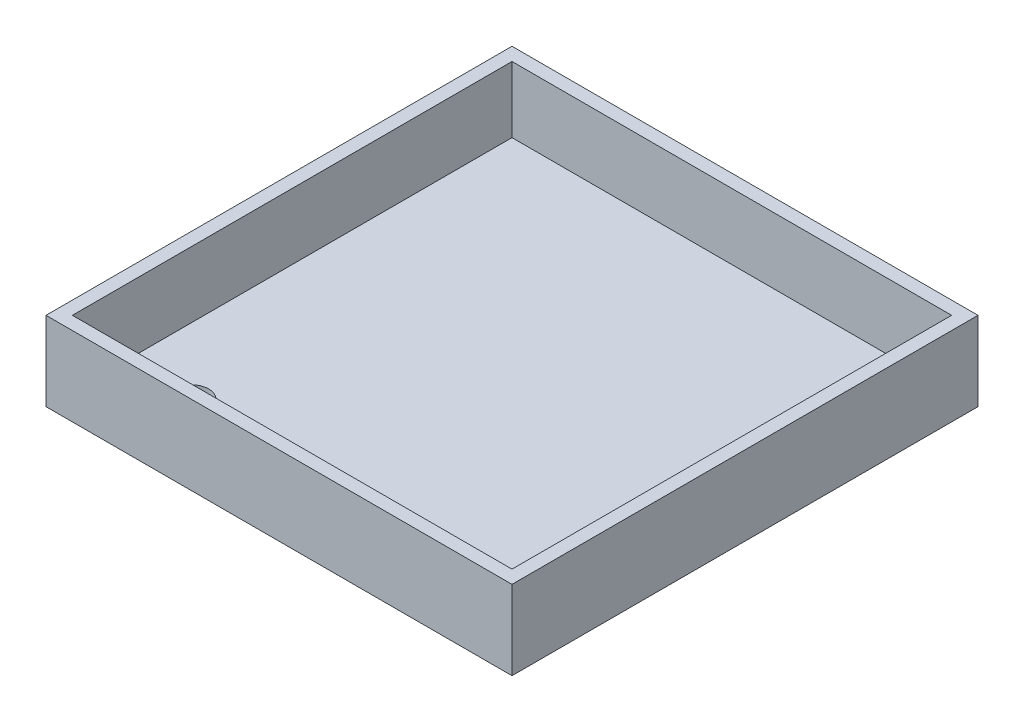
ISO-10303-21;
HEADER;
FILE_DESCRIPTION(('STEP AP214'),'2;1');
FILE_NAME('part.step','',(''),(''),'','','');
FILE_SCHEMA(('AUTOMOTIVE_DESIGN { 1 0 10303 214 1 1 1 1 }'));
ENDSEC;
DATA;
#1=APPLICATION_CONTEXT('core data for automotive mechanical design processes');
#2=APPLICATION_PROTOCOL_DEFINITION('international standard','automotive_design',2000,#1);
#3=PRODUCT_CONTEXT('',#1,'mechanical');
#4=PRODUCT('Part','Part','',(#3));
#5=PRODUCT_RELATED_PRODUCT_CATEGORY('part','',(#4));
#6=PRODUCT_DEFINITION_FORMATION('','',#4);
#7=PRODUCT_DEFINITION_CONTEXT('part definition',#1,'design');
#8=PRODUCT_DEFINITION('design','',#6,#7);
#9=PRODUCT_DEFINITION_SHAPE('','',#8);
#10=(LENGTH_UNIT() NAMED_UNIT(*) SI_UNIT(.MILLI.,.METRE.));
#11=(NAMED_UNIT(*) PLANE_ANGLE_UNIT() SI_UNIT($,.RADIAN.));
#12=(NAMED_UNIT(*) SI_UNIT($,.STERADIAN.) SOLID_ANGLE_UNIT());
#13=UNCERTAINTY_MEASURE_WITH_UNIT(LENGTH_MEASURE(1.E-05),#10,'distance_accuracy_value','');
#14=(GEOMETRIC_REPRESENTATION_CONTEXT(3) GLOBAL_UNCERTAINTY_ASSIGNED_CONTEXT((#13)) GLOBAL_UNIT_ASSIGNED_CONTEXT((#10,
#11,#12)) REPRESENTATION_CONTEXT('',''));
#15=CARTESIAN_POINT('',(0.,0.,0.));
#16=DIRECTION('',(0.,0.,1.));
#17=DIRECTION('',(1.,0.,0.));
#18=AXIS2_PLACEMENT_3D('',#15,#16,#17);
#19=CARTESIAN_POINT('',(0.,3.,0.));
#20=DIRECTION('',(0.,1.,0.));
#21=DIRECTION('',(0.,0.,1.));
#22=AXIS2_PLACEMENT_3D('',#19,#20,#21);
#23=PLANE('',#22);
#24=CARTESIAN_POINT('',(89.,3.,88.));
#25=DIRECTION('',(0.,1.,0.));
#26=DIRECTION('',(0.,0.,1.));
#27=AXIS2_PLACEMENT_3D('',#24,#25,#26);
#28=CIRCLE('',#27,2.);
#29=CARTESIAN_POINT('',(89.,3.,90.));
#30=VERTEX_POINT('',#29);
#31=EDGE_CURVE('E199',#30,#30,#28,.T.);
#32=ORIENTED_EDGE('',*,*,#31,.F.);
#33=EDGE_LOOP('',(#32));
#34=FACE_BOUND('',#33,.T.);
#35=CARTESIAN_POINT('',(15.,3.,88.));
#36=DIRECTION('',(0.,1.,0.));
#37=DIRECTION('',(0.,0.,1.));
#38=AXIS2_PLACEMENT_3D('',#35,#36,#37);
#39=CIRCLE('',#38,4.);
#40=CARTESIAN_POINT('',(15.,3.,92.));
#41=VERTEX_POINT('',#40);
#42=EDGE_CURVE('E202',#41,#41,#39,.T.);
#43=ORIENTED_EDGE('',*,*,#42,.F.);
#44=EDGE_LOOP('',(#43));
#45=FACE_BOUND('',#44,.T.);
#46=DIRECTION('',(0.,0.,1.));
#47=VECTOR('',#46,1.);
#48=CARTESIAN_POINT('',(0.,3.,0.));
#49=LINE('',#48,#47);
#50=CARTESIAN_POINT('',(0.,3.,0.));
#51=VERTEX_POINT('',#50);
#52=CARTESIAN_POINT('',(0.,3.,100.));
#53=VERTEX_POINT('',#52);
#54=EDGE_CURVE('E158',#51,#53,#49,.T.);
#55=ORIENTED_EDGE('',*,*,#54,.T.);
#56=DIRECTION('',(1.,0.,0.));
#57=VECTOR('',#56,1.);
#58=CARTESIAN_POINT('',(0.,3.,100.));
#59=LINE('',#58,#57);
#60=CARTESIAN_POINT('',(100.,3.,100.));
#61=VERTEX_POINT('',#60);
#62=EDGE_CURVE('E165',#53,#61,#59,.T.);
#63=ORIENTED_EDGE('',*,*,#62,.T.);
#64=DIRECTION('',(0.,0.,-1.));
#65=VECTOR('',#64,1.);
#66=CARTESIAN_POINT('',(100.,3.,0.));
#67=LINE('',#66,#65);
#68=CARTESIAN_POINT('',(100.,3.,0.));
#69=VERTEX_POINT('',#68);
#70=EDGE_CURVE('E44',#61,#69,#67,.T.);
#71=ORIENTED_EDGE('',*,*,#70,.T.);
#72=DIRECTION('',(-1.,0.,0.));
#73=VECTOR('',#72,1.);
#74=CARTESIAN_POINT('',(0.,3.,0.));
#75=LINE('',#74,#73);
#76=EDGE_CURVE('E11',#69,#51,#75,.T.);
#77=ORIENTED_EDGE('',*,*,#76,.T.);
#78=EDGE_LOOP('',(#55,#63,#71,#77));
#79=FACE_BOUND('',#78,.T.);
#80=ADVANCED_FACE('F36',(#34,#45,#79),#23,.T.);
#81=CARTESIAN_POINT('',(0.,0.,0.));
#82=DIRECTION('',(0.,1.,0.));
#83=DIRECTION('',(0.,0.,1.));
#84=AXIS2_PLACEMENT_3D('',#81,#82,#83);
#85=PLANE('',#84);
#86=CARTESIAN_POINT('',(89.,0.,88.));
#87=DIRECTION('',(0.,1.,0.));
#88=DIRECTION('',(0.,0.,1.));
#89=AXIS2_PLACEMENT_3D('',#86,#87,#88);
#90=CIRCLE('',#89,2.);
#91=CARTESIAN_POINT('',(89.,0.,90.));
#92=VERTEX_POINT('',#91);
#93=EDGE_CURVE('E204',#92,#92,#90,.T.);
#94=ORIENTED_EDGE('',*,*,#93,.T.);
#95=EDGE_LOOP('',(#94));
#96=FACE_BOUND('',#95,.T.);
#97=CARTESIAN_POINT('',(15.,0.,88.));
#98=DIRECTION('',(0.,1.,0.));
#99=DIRECTION('',(0.,0.,1.));
#100=AXIS2_PLACEMENT_3D('',#97,#98,#99);
#101=CIRCLE('',#100,4.);
#102=CARTESIAN_POINT('',(15.,0.,92.));
#103=VERTEX_POINT('',#102);
#104=EDGE_CURVE('E128',#103,#103,#101,.T.);
#105=ORIENTED_EDGE('',*,*,#104,.T.);
#106=EDGE_LOOP('',(#105));
#107=FACE_BOUND('',#106,.T.);
#108=DIRECTION('',(1.,0.,0.));
#109=VECTOR('',#108,1.);
#110=CARTESIAN_POINT('',(0.,0.,103.));
#111=LINE('',#110,#109);
#112=CARTESIAN_POINT('',(-2.99999999999999,0.,103.));
#113=VERTEX_POINT('',#112);
#114=CARTESIAN_POINT('',(103.,0.,103.));
#115=VERTEX_POINT('',#114);
#116=EDGE_CURVE('E100',#113,#115,#111,.T.);
#117=ORIENTED_EDGE('',*,*,#116,.F.);
#118=DIRECTION('',(0.,0.,1.));
#119=VECTOR('',#118,1.);
#120=CARTESIAN_POINT('',(-3.,0.,-3.));
#121=LINE('',#120,#119);
#122=CARTESIAN_POINT('',(-3.,0.,-3.));
#123=VERTEX_POINT('',#122);
#124=EDGE_CURVE('E139',#123,#113,#121,.T.);
#125=ORIENTED_EDGE('',*,*,#124,.F.);
#126=DIRECTION('',(-1.,0.,0.));
#127=VECTOR('',#126,1.);
#128=CARTESIAN_POINT('',(100.,0.,-3.));
#129=LINE('',#128,#127);
#130=CARTESIAN_POINT('',(103.,0.,-3.));
#131=VERTEX_POINT('',#130);
#132=EDGE_CURVE('E115',#131,#123,#129,.T.);
#133=ORIENTED_EDGE('',*,*,#132,.F.);
#134=DIRECTION('',(0.,0.,-1.));
#135=VECTOR('',#134,1.);
#136=CARTESIAN_POINT('',(103.,0.,103.));
#137=LINE('',#136,#135);
#138=EDGE_CURVE('E114',#115,#131,#137,.T.);
#139=ORIENTED_EDGE('',*,*,#138,.F.);
#140=EDGE_LOOP('',(#117,#125,#133,#139));
#141=FACE_BOUND('',#140,.T.);
#142=ADVANCED_FACE('F38',(#96,#107,#141),#85,.F.);
#143=CARTESIAN_POINT('',(0.,0.,100.));
#144=DIRECTION('',(0.,0.,-1.));
#145=DIRECTION('',(-1.,0.,0.));
#146=AXIS2_PLACEMENT_3D('',#143,#144,#145);
#147=PLANE('',#146);
#148=ORIENTED_EDGE('',*,*,#62,.F.);
#149=DIRECTION('',(0.,-1.,0.));
#150=VECTOR('',#149,1.);
#151=CARTESIAN_POINT('',(0.,0.,100.));
#152=LINE('',#151,#150);
#153=CARTESIAN_POINT('',(0.,18.,100.));
#154=VERTEX_POINT('',#153);
#155=EDGE_CURVE('E152',#154,#53,#152,.T.);
#156=ORIENTED_EDGE('',*,*,#155,.F.);
#157=DIRECTION('',(-1.,0.,0.));
#158=VECTOR('',#157,1.);
#159=CARTESIAN_POINT('',(0.,18.,100.));
#160=LINE('',#159,#158);
#161=CARTESIAN_POINT('',(100.,18.,100.));
#162=VERTEX_POINT('',#161);
#163=EDGE_CURVE('E111',#162,#154,#160,.T.);
#164=ORIENTED_EDGE('',*,*,#163,.F.);
#165=DIRECTION('',(0.,1.,0.));
#166=VECTOR('',#165,1.);
#167=CARTESIAN_POINT('',(100.,0.,100.));
#168=LINE('',#167,#166);
#169=EDGE_CURVE('E58',#61,#162,#168,.T.);
#170=ORIENTED_EDGE('',*,*,#169,.F.);
#171=EDGE_LOOP('',(#148,#156,#164,#170));
#172=FACE_BOUND('',#171,.T.);
#173=ADVANCED_FACE('F182',(#172),#147,.T.);
#174=CARTESIAN_POINT('',(0.,18.,103.));
#175=DIRECTION('',(0.,-1.,0.));
#176=DIRECTION('',(0.,0.,-1.));
#177=AXIS2_PLACEMENT_3D('',#174,#175,#176);
#178=PLANE('',#177);
#179=DIRECTION('',(1.,0.,0.));
#180=VECTOR('',#179,1.);
#181=CARTESIAN_POINT('',(100.,18.,0.));
#182=LINE('',#181,#180);
#183=CARTESIAN_POINT('',(0.,18.,0.));
#184=VERTEX_POINT('',#183);
#185=CARTESIAN_POINT('',(100.,18.,0.));
#186=VERTEX_POINT('',#185);
#187=EDGE_CURVE('E150',#184,#186,#182,.T.);
#188=ORIENTED_EDGE('',*,*,#187,.T.);
#189=DIRECTION('',(0.,0.,1.));
#190=VECTOR('',#189,1.);
#191=CARTESIAN_POINT('',(100.,18.,103.));
#192=LINE('',#191,#190);
#193=EDGE_CURVE('E125',#186,#162,#192,.T.);
#194=ORIENTED_EDGE('',*,*,#193,.T.);
#195=ORIENTED_EDGE('',*,*,#163,.T.);
#196=DIRECTION('',(0.,0.,-1.));
#197=VECTOR('',#196,1.);
#198=CARTESIAN_POINT('',(0.,18.,-3.));
#199=LINE('',#198,#197);
#200=EDGE_CURVE('E134',#154,#184,#199,.T.);
#201=ORIENTED_EDGE('',*,*,#200,.T.);
#202=EDGE_LOOP('',(#188,#194,#195,#201));
#203=FACE_BOUND('',#202,.T.);
#204=DIRECTION('',(0.,0.,1.));
#205=VECTOR('',#204,1.);
#206=CARTESIAN_POINT('',(103.,18.,103.));
#207=LINE('',#206,#205);
#208=CARTESIAN_POINT('',(103.,18.,-3.));
#209=VERTEX_POINT('',#208);
#210=CARTESIAN_POINT('',(103.,18.,103.));
#211=VERTEX_POINT('',#210);
#212=EDGE_CURVE('E124',#209,#211,#207,.T.);
#213=ORIENTED_EDGE('',*,*,#212,.F.);
#214=DIRECTION('',(1.,0.,0.));
#215=VECTOR('',#214,1.);
#216=CARTESIAN_POINT('',(100.,18.,-3.));
#217=LINE('',#216,#215);
#218=CARTESIAN_POINT('',(-3.,18.,-3.));
#219=VERTEX_POINT('',#218);
#220=EDGE_CURVE('E149',#219,#209,#217,.T.);
#221=ORIENTED_EDGE('',*,*,#220,.F.);
#222=DIRECTION('',(0.,0.,-1.));
#223=VECTOR('',#222,1.);
#224=CARTESIAN_POINT('',(-3.,18.,-3.));
#225=LINE('',#224,#223);
#226=CARTESIAN_POINT('',(-2.99999999999999,18.,103.));
#227=VERTEX_POINT('',#226);
#228=EDGE_CURVE('E142',#227,#219,#225,.T.);
#229=ORIENTED_EDGE('',*,*,#228,.F.);
#230=DIRECTION('',(-1.,0.,0.));
#231=VECTOR('',#230,1.);
#232=CARTESIAN_POINT('',(0.,18.,103.));
#233=LINE('',#232,#231);
#234=EDGE_CURVE('E110',#211,#227,#233,.T.);
#235=ORIENTED_EDGE('',*,*,#234,.F.);
#236=EDGE_LOOP('',(#213,#221,#229,#235));
#237=FACE_BOUND('',#236,.T.);
#238=ADVANCED_FACE('F179',(#203,#237),#178,.F.);
#239=CARTESIAN_POINT('',(0.,0.,103.));
#240=DIRECTION('',(0.,0.,-1.));
#241=DIRECTION('',(-1.,0.,0.));
#242=AXIS2_PLACEMENT_3D('',#239,#240,#241);
#243=PLANE('',#242);
#244=ORIENTED_EDGE('',*,*,#234,.T.);
#245=DIRECTION('',(0.,1.,0.));
#246=VECTOR('',#245,1.);
#247=CARTESIAN_POINT('',(-2.99999999999999,0.,103.));
#248=LINE('',#247,#246);
#249=EDGE_CURVE('E106',#113,#227,#248,.T.);
#250=ORIENTED_EDGE('',*,*,#249,.F.);
#251=ORIENTED_EDGE('',*,*,#116,.T.);
#252=DIRECTION('',(0.,-1.,0.));
#253=VECTOR('',#252,1.);
#254=CARTESIAN_POINT('',(103.,0.,103.));
#255=LINE('',#254,#253);
#256=EDGE_CURVE('E104',#211,#115,#255,.T.);
#257=ORIENTED_EDGE('',*,*,#256,.F.);
#258=EDGE_LOOP('',(#244,#250,#251,#257));
#259=FACE_BOUND('',#258,.T.);
#260=ADVANCED_FACE('F102',(#259),#243,.F.);
#261=CARTESIAN_POINT('',(0.,0.,0.));
#262=DIRECTION('',(0.,0.,1.));
#263=DIRECTION('',(1.,0.,0.));
#264=AXIS2_PLACEMENT_3D('',#261,#262,#263);
#265=PLANE('',#264);
#266=ORIENTED_EDGE('',*,*,#76,.F.);
#267=DIRECTION('',(0.,-1.,0.));
#268=VECTOR('',#267,1.);
#269=CARTESIAN_POINT('',(100.,0.,0.));
#270=LINE('',#269,#268);
#271=EDGE_CURVE('E145',#186,#69,#270,.T.);
#272=ORIENTED_EDGE('',*,*,#271,.F.);
#273=ORIENTED_EDGE('',*,*,#187,.F.);
#274=DIRECTION('',(0.,1.,0.));
#275=VECTOR('',#274,1.);
#276=CARTESIAN_POINT('',(0.,0.,0.));
#277=LINE('',#276,#275);
#278=EDGE_CURVE('E51',#51,#184,#277,.T.);
#279=ORIENTED_EDGE('',*,*,#278,.F.);
#280=EDGE_LOOP('',(#266,#272,#273,#279));
#281=FACE_BOUND('',#280,.T.);
#282=ADVANCED_FACE('F174',(#281),#265,.T.);
#283=CARTESIAN_POINT('',(0.,0.,-3.));
#284=DIRECTION('',(0.,0.,1.));
#285=DIRECTION('',(1.,0.,0.));
#286=AXIS2_PLACEMENT_3D('',#283,#284,#285);
#287=PLANE('',#286);
#288=ORIENTED_EDGE('',*,*,#220,.T.);
#289=DIRECTION('',(0.,1.,0.));
#290=VECTOR('',#289,1.);
#291=CARTESIAN_POINT('',(103.,0.,-3.));
#292=LINE('',#291,#290);
#293=EDGE_CURVE('E119',#131,#209,#292,.T.);
#294=ORIENTED_EDGE('',*,*,#293,.F.);
#295=ORIENTED_EDGE('',*,*,#132,.T.);
#296=DIRECTION('',(0.,-1.,0.));
#297=VECTOR('',#296,1.);
#298=CARTESIAN_POINT('',(-3.,0.,-3.));
#299=LINE('',#298,#297);
#300=EDGE_CURVE('E136',#219,#123,#299,.T.);
#301=ORIENTED_EDGE('',*,*,#300,.F.);
#302=EDGE_LOOP('',(#288,#294,#295,#301));
#303=FACE_BOUND('',#302,.T.);
#304=ADVANCED_FACE('F229',(#303),#287,.F.);
#305=CARTESIAN_POINT('',(-3.,0.,0.));
#306=DIRECTION('',(1.,0.,0.));
#307=DIRECTION('',(0.,0.,-1.));
#308=AXIS2_PLACEMENT_3D('',#305,#306,#307);
#309=PLANE('',#308);
#310=ORIENTED_EDGE('',*,*,#300,.T.);
#311=ORIENTED_EDGE('',*,*,#124,.T.);
#312=ORIENTED_EDGE('',*,*,#249,.T.);
#313=ORIENTED_EDGE('',*,*,#228,.T.);
#314=EDGE_LOOP('',(#310,#311,#312,#313));
#315=FACE_BOUND('',#314,.T.);
#316=ADVANCED_FACE('F226',(#315),#309,.F.);
#317=CARTESIAN_POINT('',(0.,0.,0.));
#318=DIRECTION('',(1.,0.,0.));
#319=DIRECTION('',(0.,0.,-1.));
#320=AXIS2_PLACEMENT_3D('',#317,#318,#319);
#321=PLANE('',#320);
#322=ORIENTED_EDGE('',*,*,#200,.F.);
#323=ORIENTED_EDGE('',*,*,#155,.T.);
#324=ORIENTED_EDGE('',*,*,#54,.F.);
#325=ORIENTED_EDGE('',*,*,#278,.T.);
#326=EDGE_LOOP('',(#322,#323,#324,#325));
#327=FACE_BOUND('',#326,.T.);
#328=ADVANCED_FACE('F178',(#327),#321,.T.);
#329=CARTESIAN_POINT('',(103.,0.,0.));
#330=DIRECTION('',(-1.,0.,0.));
#331=DIRECTION('',(0.,0.,1.));
#332=AXIS2_PLACEMENT_3D('',#329,#330,#331);
#333=PLANE('',#332);
#334=ORIENTED_EDGE('',*,*,#256,.T.);
#335=ORIENTED_EDGE('',*,*,#138,.T.);
#336=ORIENTED_EDGE('',*,*,#293,.T.);
#337=ORIENTED_EDGE('',*,*,#212,.T.);
#338=EDGE_LOOP('',(#334,#335,#336,#337));
#339=FACE_BOUND('',#338,.T.);
#340=ADVANCED_FACE('F122',(#339),#333,.F.);
#341=CARTESIAN_POINT('',(100.,0.,0.));
#342=DIRECTION('',(-1.,0.,0.));
#343=DIRECTION('',(0.,0.,1.));
#344=AXIS2_PLACEMENT_3D('',#341,#342,#343);
#345=PLANE('',#344);
#346=ORIENTED_EDGE('',*,*,#193,.F.);
#347=ORIENTED_EDGE('',*,*,#271,.T.);
#348=ORIENTED_EDGE('',*,*,#70,.F.);
#349=ORIENTED_EDGE('',*,*,#169,.T.);
#350=EDGE_LOOP('',(#346,#347,#348,#349));
#351=FACE_BOUND('',#350,.T.);
#352=ADVANCED_FACE('F173',(#351),#345,.T.);
#353=CARTESIAN_POINT('',(15.,3.,88.));
#354=DIRECTION('',(0.,1.,0.));
#355=DIRECTION('',(0.,0.,1.));
#356=AXIS2_PLACEMENT_3D('',#353,#354,#355);
#357=CYLINDRICAL_SURFACE('',#356,4.);
#358=ORIENTED_EDGE('',*,*,#104,.F.);
#359=EDGE_LOOP('',(#358));
#360=FACE_BOUND('',#359,.T.);
#361=ORIENTED_EDGE('',*,*,#42,.T.);
#362=EDGE_LOOP('',(#361));
#363=FACE_BOUND('',#362,.T.);
#364=ADVANCED_FACE('F212',(#360,#363),#357,.F.);
#365=CARTESIAN_POINT('',(89.,3.,88.));
#366=DIRECTION('',(0.,1.,0.));
#367=DIRECTION('',(0.,0.,1.));
#368=AXIS2_PLACEMENT_3D('',#365,#366,#367);
#369=CYLINDRICAL_SURFACE('',#368,2.);
#370=ORIENTED_EDGE('',*,*,#93,.F.);
#371=EDGE_LOOP('',(#370));
#372=FACE_BOUND('',#371,.T.);
#373=ORIENTED_EDGE('',*,*,#31,.T.);
#374=EDGE_LOOP('',(#373));
#375=FACE_BOUND('',#374,.T.);
#376=ADVANCED_FACE('F210',(#372,#375),#369,.F.);
#377=CLOSED_SHELL('',(#80,#142,#173,#238,#260,#282,#304,#316,#328,#340,#352,#364,#376));
#378=MANIFOLD_SOLID_BREP('B2',#377);
#379=ADVANCED_BREP_SHAPE_REPRESENTATION('',(#18,#378),#14);
#380=SHAPE_DEFINITION_REPRESENTATION(#9,#379);
ENDSEC;
END-ISO-10303-21;
